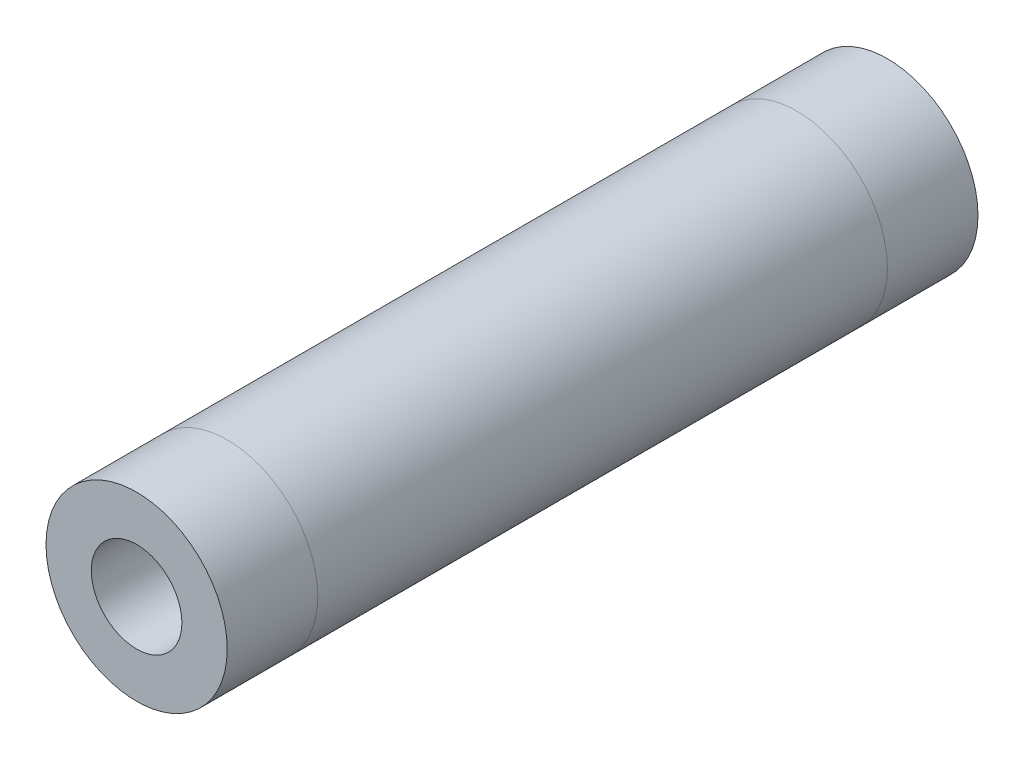
ISO-10303-21;
HEADER;
FILE_DESCRIPTION(('STEP AP214'),'2;1');
FILE_NAME('part.step','',(''),(''),'','','');
FILE_SCHEMA(('AUTOMOTIVE_DESIGN { 1 0 10303 214 1 1 1 1 }'));
ENDSEC;
DATA;
#1=APPLICATION_CONTEXT('core data for automotive mechanical design processes');
#2=APPLICATION_PROTOCOL_DEFINITION('international standard','automotive_design',2000,#1);
#3=PRODUCT_CONTEXT('',#1,'mechanical');
#4=PRODUCT('Part','Part','',(#3));
#5=PRODUCT_RELATED_PRODUCT_CATEGORY('part','',(#4));
#6=PRODUCT_DEFINITION_FORMATION('','',#4);
#7=PRODUCT_DEFINITION_CONTEXT('part definition',#1,'design');
#8=PRODUCT_DEFINITION('design','',#6,#7);
#9=PRODUCT_DEFINITION_SHAPE('','',#8);
#10=(LENGTH_UNIT() NAMED_UNIT(*) SI_UNIT(.MILLI.,.METRE.));
#11=(NAMED_UNIT(*) PLANE_ANGLE_UNIT() SI_UNIT($,.RADIAN.));
#12=(NAMED_UNIT(*) SI_UNIT($,.STERADIAN.) SOLID_ANGLE_UNIT());
#13=UNCERTAINTY_MEASURE_WITH_UNIT(LENGTH_MEASURE(1.E-05),#10,'distance_accuracy_value','');
#14=(GEOMETRIC_REPRESENTATION_CONTEXT(3) GLOBAL_UNCERTAINTY_ASSIGNED_CONTEXT((#13)) GLOBAL_UNIT_ASSIGNED_CONTEXT((#10,
#11,#12)) REPRESENTATION_CONTEXT('',''));
#15=CARTESIAN_POINT('',(0.,0.,0.));
#16=DIRECTION('',(0.,0.,1.));
#17=DIRECTION('',(1.,0.,0.));
#18=AXIS2_PLACEMENT_3D('',#15,#16,#17);
#19=CARTESIAN_POINT('',(0.,0.,-86.1379222421383));
#20=DIRECTION('',(0.,0.,1.));
#21=DIRECTION('',(1.,0.,0.));
#22=AXIS2_PLACEMENT_3D('',#19,#20,#21);
#23=CYLINDRICAL_SURFACE('',#22,6.35);
#24=CARTESIAN_POINT('',(0.,0.,-68.17741));
#25=DIRECTION('',(0.,0.,1.));
#26=DIRECTION('',(1.,0.,0.));
#27=AXIS2_PLACEMENT_3D('',#24,#25,#26);
#28=CIRCLE('',#27,6.35);
#29=CARTESIAN_POINT('',(6.35,0.,-68.17741));
#30=VERTEX_POINT('',#29);
#31=EDGE_CURVE('E12',#30,#30,#28,.F.);
#32=ORIENTED_EDGE('',*,*,#31,.F.);
#33=EDGE_LOOP('',(#32));
#34=FACE_BOUND('',#33,.T.);
#35=CARTESIAN_POINT('',(0.,0.,-28.2575));
#36=DIRECTION('',(0.,0.,1.));
#37=DIRECTION('',(1.,0.,0.));
#38=AXIS2_PLACEMENT_3D('',#35,#36,#37);
#39=CIRCLE('',#38,6.35);
#40=CARTESIAN_POINT('',(6.35,0.,-28.2575));
#41=VERTEX_POINT('',#40);
#42=EDGE_CURVE('E79',#41,#41,#39,.T.);
#43=ORIENTED_EDGE('',*,*,#42,.F.);
#44=EDGE_LOOP('',(#43));
#45=FACE_BOUND('',#44,.T.);
#46=ADVANCED_FACE('F68',(#34,#45),#23,.T.);
#47=CARTESIAN_POINT('',(0.,0.,-28.2575));
#48=DIRECTION('',(0.,0.,1.));
#49=DIRECTION('',(1.,0.,0.));
#50=AXIS2_PLACEMENT_3D('',#47,#48,#49);
#51=PLANE('',#50);
#52=CARTESIAN_POINT('',(0.,0.,-28.2575));
#53=DIRECTION('',(0.,0.,1.));
#54=DIRECTION('',(1.,0.,0.));
#55=AXIS2_PLACEMENT_3D('',#52,#53,#54);
#56=CIRCLE('',#55,4.7625);
#57=CARTESIAN_POINT('',(4.7625,0.,-28.2575));
#58=VERTEX_POINT('',#57);
#59=EDGE_CURVE('E81',#58,#58,#56,.T.);
#60=ORIENTED_EDGE('',*,*,#59,.F.);
#61=EDGE_LOOP('',(#60));
#62=FACE_BOUND('',#61,.T.);
#63=ORIENTED_EDGE('',*,*,#42,.T.);
#64=EDGE_LOOP('',(#63));
#65=FACE_BOUND('',#64,.T.);
#66=ADVANCED_FACE('F86',(#62,#65),#51,.T.);
#67=CARTESIAN_POINT('',(0.,0.,-86.1379222421383));
#68=DIRECTION('',(0.,0.,1.));
#69=DIRECTION('',(1.,0.,0.));
#70=AXIS2_PLACEMENT_3D('',#67,#68,#69);
#71=CYLINDRICAL_SURFACE('',#70,4.7625);
#72=CARTESIAN_POINT('',(0.,0.,-68.17741));
#73=DIRECTION('',(0.,0.,1.));
#74=DIRECTION('',(1.,0.,0.));
#75=AXIS2_PLACEMENT_3D('',#72,#73,#74);
#76=CIRCLE('',#75,4.7625);
#77=CARTESIAN_POINT('',(4.7625,0.,-68.17741));
#78=VERTEX_POINT('',#77);
#79=EDGE_CURVE('E71',#78,#78,#76,.F.);
#80=ORIENTED_EDGE('',*,*,#79,.T.);
#81=EDGE_LOOP('',(#80));
#82=FACE_BOUND('',#81,.T.);
#83=ORIENTED_EDGE('',*,*,#59,.T.);
#84=EDGE_LOOP('',(#83));
#85=FACE_BOUND('',#84,.T.);
#86=ADVANCED_FACE('F93',(#82,#85),#71,.F.);
#87=CARTESIAN_POINT('',(0.,0.,-68.17741));
#88=DIRECTION('',(0.,0.,1.));
#89=DIRECTION('',(1.,0.,0.));
#90=AXIS2_PLACEMENT_3D('',#87,#88,#89);
#91=PLANE('',#90);
#92=ORIENTED_EDGE('',*,*,#31,.T.);
#93=EDGE_LOOP('',(#92));
#94=FACE_BOUND('',#93,.T.);
#95=ORIENTED_EDGE('',*,*,#79,.F.);
#96=EDGE_LOOP('',(#95));
#97=FACE_BOUND('',#96,.T.);
#98=ADVANCED_FACE('F98',(#94,#97),#91,.F.);
#99=CLOSED_SHELL('',(#46,#66,#86,#98));
#100=MANIFOLD_SOLID_BREP('B2',#99);
#101=CARTESIAN_POINT('',(0.,0.,-68.17741));
#102=DIRECTION('',(0.,0.,1.));
#103=DIRECTION('',(1.,0.,0.));
#104=AXIS2_PLACEMENT_3D('',#101,#102,#103);
#105=PLANE('',#104);
#106=CARTESIAN_POINT('',(0.,0.,-68.17741));
#107=DIRECTION('',(0.,0.,1.));
#108=DIRECTION('',(1.,0.,0.));
#109=AXIS2_PLACEMENT_3D('',#106,#107,#108);
#110=CIRCLE('',#109,6.35);
#111=CARTESIAN_POINT('',(6.35,0.,-68.17741));
#112=VERTEX_POINT('',#111);
#113=EDGE_CURVE('E67',#112,#112,#110,.T.);
#114=ORIENTED_EDGE('',*,*,#113,.T.);
#115=EDGE_LOOP('',(#114));
#116=FACE_BOUND('',#115,.T.);
#117=CARTESIAN_POINT('',(0.,0.,-68.17741));
#118=DIRECTION('',(0.,0.,1.));
#119=DIRECTION('',(1.,0.,0.));
#120=AXIS2_PLACEMENT_3D('',#117,#118,#119);
#121=CIRCLE('',#120,4.7625);
#122=CARTESIAN_POINT('',(4.7625,0.,-68.17741));
#123=VERTEX_POINT('',#122);
#124=EDGE_CURVE('E151',#123,#123,#121,.T.);
#125=ORIENTED_EDGE('',*,*,#124,.F.);
#126=EDGE_LOOP('',(#125));
#127=FACE_BOUND('',#126,.T.);
#128=ADVANCED_FACE('F137',(#116,#127),#105,.T.);
#129=CARTESIAN_POINT('',(0.,0.,-68.17741));
#130=DIRECTION('',(0.,0.,-1.));
#131=DIRECTION('',(-1.,0.,0.));
#132=AXIS2_PLACEMENT_3D('',#129,#130,#131);
#133=CYLINDRICAL_SURFACE('',#132,6.35);
#134=ORIENTED_EDGE('',*,*,#113,.F.);
#135=EDGE_LOOP('',(#134));
#136=FACE_BOUND('',#135,.T.);
#137=CARTESIAN_POINT('',(0.,0.,-74.52741));
#138=DIRECTION('',(0.,0.,1.));
#139=DIRECTION('',(1.,0.,0.));
#140=AXIS2_PLACEMENT_3D('',#137,#138,#139);
#141=CIRCLE('',#140,6.35);
#142=CARTESIAN_POINT('',(6.35,0.,-74.52741));
#143=VERTEX_POINT('',#142);
#144=EDGE_CURVE('E149',#143,#143,#141,.T.);
#145=ORIENTED_EDGE('',*,*,#144,.T.);
#146=EDGE_LOOP('',(#145));
#147=FACE_BOUND('',#146,.T.);
#148=ADVANCED_FACE('F139',(#136,#147),#133,.T.);
#149=CARTESIAN_POINT('',(0.,0.,-68.17741));
#150=DIRECTION('',(0.,0.,-1.));
#151=DIRECTION('',(-1.,0.,0.));
#152=AXIS2_PLACEMENT_3D('',#149,#150,#151);
#153=CYLINDRICAL_SURFACE('',#152,3.175);
#154=CARTESIAN_POINT('',(0.,0.,-74.52741));
#155=DIRECTION('',(0.,0.,1.));
#156=DIRECTION('',(1.,0.,0.));
#157=AXIS2_PLACEMENT_3D('',#154,#155,#156);
#158=CIRCLE('',#157,3.175);
#159=CARTESIAN_POINT('',(3.175,0.,-74.52741));
#160=VERTEX_POINT('',#159);
#161=EDGE_CURVE('E141',#160,#160,#158,.T.);
#162=ORIENTED_EDGE('',*,*,#161,.F.);
#163=EDGE_LOOP('',(#162));
#164=FACE_BOUND('',#163,.T.);
#165=CARTESIAN_POINT('',(0.,0.,-61.82741));
#166=DIRECTION('',(0.,0.,1.));
#167=DIRECTION('',(1.,0.,0.));
#168=AXIS2_PLACEMENT_3D('',#165,#166,#167);
#169=CIRCLE('',#168,3.175);
#170=CARTESIAN_POINT('',(3.175,0.,-61.82741));
#171=VERTEX_POINT('',#170);
#172=EDGE_CURVE('E161',#171,#171,#169,.T.);
#173=ORIENTED_EDGE('',*,*,#172,.T.);
#174=EDGE_LOOP('',(#173));
#175=FACE_BOUND('',#174,.T.);
#176=ADVANCED_FACE('F166',(#164,#175),#153,.F.);
#177=CARTESIAN_POINT('',(0.,0.,-74.52741));
#178=DIRECTION('',(0.,0.,1.));
#179=DIRECTION('',(1.,0.,0.));
#180=AXIS2_PLACEMENT_3D('',#177,#178,#179);
#181=PLANE('',#180);
#182=ORIENTED_EDGE('',*,*,#144,.F.);
#183=EDGE_LOOP('',(#182));
#184=FACE_BOUND('',#183,.T.);
#185=ORIENTED_EDGE('',*,*,#161,.T.);
#186=EDGE_LOOP('',(#185));
#187=FACE_BOUND('',#186,.T.);
#188=ADVANCED_FACE('F171',(#184,#187),#181,.F.);
#189=CARTESIAN_POINT('',(0.,0.,-61.82741));
#190=DIRECTION('',(0.,0.,1.));
#191=DIRECTION('',(1.,0.,0.));
#192=AXIS2_PLACEMENT_3D('',#189,#190,#191);
#193=PLANE('',#192);
#194=CARTESIAN_POINT('',(0.,0.,-61.82741));
#195=DIRECTION('',(0.,0.,1.));
#196=DIRECTION('',(1.,0.,0.));
#197=AXIS2_PLACEMENT_3D('',#194,#195,#196);
#198=CIRCLE('',#197,4.7625);
#199=CARTESIAN_POINT('',(4.7625,0.,-61.82741));
#200=VERTEX_POINT('',#199);
#201=EDGE_CURVE('E154',#200,#200,#198,.T.);
#202=ORIENTED_EDGE('',*,*,#201,.T.);
#203=EDGE_LOOP('',(#202));
#204=FACE_BOUND('',#203,.T.);
#205=ORIENTED_EDGE('',*,*,#172,.F.);
#206=EDGE_LOOP('',(#205));
#207=FACE_BOUND('',#206,.T.);
#208=ADVANCED_FACE('F168',(#204,#207),#193,.T.);
#209=CARTESIAN_POINT('',(0.,0.,-61.82741));
#210=DIRECTION('',(0.,0.,-1.));
#211=DIRECTION('',(-1.,0.,0.));
#212=AXIS2_PLACEMENT_3D('',#209,#210,#211);
#213=CYLINDRICAL_SURFACE('',#212,4.7625);
#214=ORIENTED_EDGE('',*,*,#201,.F.);
#215=EDGE_LOOP('',(#214));
#216=FACE_BOUND('',#215,.T.);
#217=ORIENTED_EDGE('',*,*,#124,.T.);
#218=EDGE_LOOP('',(#217));
#219=FACE_BOUND('',#218,.T.);
#220=ADVANCED_FACE('F170',(#216,#219),#213,.T.);
#221=CLOSED_SHELL('',(#128,#148,#176,#188,#208,#220));
#222=MANIFOLD_SOLID_BREP('B7',#221);
#223=CARTESIAN_POINT('',(0.,0.,-28.2575));
#224=DIRECTION('',(0.,0.,1.));
#225=DIRECTION('',(1.,0.,0.));
#226=AXIS2_PLACEMENT_3D('',#223,#224,#225);
#227=CYLINDRICAL_SURFACE('',#226,6.35);
#228=CARTESIAN_POINT('',(0.,0.,-28.2575));
#229=DIRECTION('',(0.,0.,1.));
#230=DIRECTION('',(1.,0.,0.));
#231=AXIS2_PLACEMENT_3D('',#228,#229,#230);
#232=CIRCLE('',#231,6.35);
#233=CARTESIAN_POINT('',(6.35,0.,-28.2575));
#234=VERTEX_POINT('',#233);
#235=EDGE_CURVE('E136',#234,#234,#232,.T.);
#236=ORIENTED_EDGE('',*,*,#235,.T.);
#237=EDGE_LOOP('',(#236));
#238=FACE_BOUND('',#237,.T.);
#239=CARTESIAN_POINT('',(0.,0.,-21.9075));
#240=DIRECTION('',(0.,0.,1.));
#241=DIRECTION('',(1.,0.,0.));
#242=AXIS2_PLACEMENT_3D('',#239,#240,#241);
#243=CIRCLE('',#242,6.35);
#244=CARTESIAN_POINT('',(6.35,0.,-21.9075));
#245=VERTEX_POINT('',#244);
#246=EDGE_CURVE('E249',#245,#245,#243,.T.);
#247=ORIENTED_EDGE('',*,*,#246,.F.);
#248=EDGE_LOOP('',(#247));
#249=FACE_BOUND('',#248,.T.);
#250=ADVANCED_FACE('F238',(#238,#249),#227,.T.);
#251=CARTESIAN_POINT('',(0.,0.,-28.2575));
#252=DIRECTION('',(0.,0.,1.));
#253=DIRECTION('',(1.,0.,0.));
#254=AXIS2_PLACEMENT_3D('',#251,#252,#253);
#255=CYLINDRICAL_SURFACE('',#254,3.175);
#256=CARTESIAN_POINT('',(0.,0.,-21.9075));
#257=DIRECTION('',(0.,0.,1.));
#258=DIRECTION('',(1.,0.,0.));
#259=AXIS2_PLACEMENT_3D('',#256,#257,#258);
#260=CIRCLE('',#259,3.175);
#261=CARTESIAN_POINT('',(3.175,0.,-21.9075));
#262=VERTEX_POINT('',#261);
#263=EDGE_CURVE('E241',#262,#262,#260,.T.);
#264=ORIENTED_EDGE('',*,*,#263,.T.);
#265=EDGE_LOOP('',(#264));
#266=FACE_BOUND('',#265,.T.);
#267=CARTESIAN_POINT('',(0.,0.,-34.6075));
#268=DIRECTION('',(0.,0.,1.));
#269=DIRECTION('',(1.,0.,0.));
#270=AXIS2_PLACEMENT_3D('',#267,#268,#269);
#271=CIRCLE('',#270,3.175);
#272=CARTESIAN_POINT('',(3.175,0.,-34.6075));
#273=VERTEX_POINT('',#272);
#274=EDGE_CURVE('E261',#273,#273,#271,.T.);
#275=ORIENTED_EDGE('',*,*,#274,.F.);
#276=EDGE_LOOP('',(#275));
#277=FACE_BOUND('',#276,.T.);
#278=ADVANCED_FACE('F269',(#266,#277),#255,.F.);
#279=CARTESIAN_POINT('',(0.,0.,-28.2575));
#280=DIRECTION('',(0.,0.,1.));
#281=DIRECTION('',(1.,0.,0.));
#282=AXIS2_PLACEMENT_3D('',#279,#280,#281);
#283=PLANE('',#282);
#284=CARTESIAN_POINT('',(0.,0.,-28.2575));
#285=DIRECTION('',(0.,0.,1.));
#286=DIRECTION('',(1.,0.,0.));
#287=AXIS2_PLACEMENT_3D('',#284,#285,#286);
#288=CIRCLE('',#287,4.7625);
#289=CARTESIAN_POINT('',(4.7625,0.,-28.2575));
#290=VERTEX_POINT('',#289);
#291=EDGE_CURVE('E251',#290,#290,#288,.T.);
#292=ORIENTED_EDGE('',*,*,#291,.T.);
#293=EDGE_LOOP('',(#292));
#294=FACE_BOUND('',#293,.T.);
#295=ORIENTED_EDGE('',*,*,#235,.F.);
#296=EDGE_LOOP('',(#295));
#297=FACE_BOUND('',#296,.T.);
#298=ADVANCED_FACE('F271',(#294,#297),#283,.F.);
#299=CARTESIAN_POINT('',(0.,0.,-21.9075));
#300=DIRECTION('',(0.,0.,1.));
#301=DIRECTION('',(1.,0.,0.));
#302=AXIS2_PLACEMENT_3D('',#299,#300,#301);
#303=PLANE('',#302);
#304=ORIENTED_EDGE('',*,*,#246,.T.);
#305=EDGE_LOOP('',(#304));
#306=FACE_BOUND('',#305,.T.);
#307=ORIENTED_EDGE('',*,*,#263,.F.);
#308=EDGE_LOOP('',(#307));
#309=FACE_BOUND('',#308,.T.);
#310=ADVANCED_FACE('F277',(#306,#309),#303,.T.);
#311=CARTESIAN_POINT('',(0.,0.,-34.6075));
#312=DIRECTION('',(0.,0.,1.));
#313=DIRECTION('',(1.,0.,0.));
#314=AXIS2_PLACEMENT_3D('',#311,#312,#313);
#315=CYLINDRICAL_SURFACE('',#314,4.7625);
#316=CARTESIAN_POINT('',(0.,0.,-34.6075));
#317=DIRECTION('',(0.,0.,1.));
#318=DIRECTION('',(1.,0.,0.));
#319=AXIS2_PLACEMENT_3D('',#316,#317,#318);
#320=CIRCLE('',#319,4.7625);
#321=CARTESIAN_POINT('',(4.7625,0.,-34.6075));
#322=VERTEX_POINT('',#321);
#323=EDGE_CURVE('E254',#322,#322,#320,.T.);
#324=ORIENTED_EDGE('',*,*,#323,.T.);
#325=EDGE_LOOP('',(#324));
#326=FACE_BOUND('',#325,.T.);
#327=ORIENTED_EDGE('',*,*,#291,.F.);
#328=EDGE_LOOP('',(#327));
#329=FACE_BOUND('',#328,.T.);
#330=ADVANCED_FACE('F282',(#326,#329),#315,.T.);
#331=CARTESIAN_POINT('',(0.,0.,-34.6075));
#332=DIRECTION('',(0.,0.,1.));
#333=DIRECTION('',(1.,0.,0.));
#334=AXIS2_PLACEMENT_3D('',#331,#332,#333);
#335=PLANE('',#334);
#336=ORIENTED_EDGE('',*,*,#274,.T.);
#337=EDGE_LOOP('',(#336));
#338=FACE_BOUND('',#337,.T.);
#339=ORIENTED_EDGE('',*,*,#323,.F.);
#340=EDGE_LOOP('',(#339));
#341=FACE_BOUND('',#340,.T.);
#342=ADVANCED_FACE('F266',(#338,#341),#335,.F.);
#343=CLOSED_SHELL('',(#250,#278,#298,#310,#330,#342));
#344=MANIFOLD_SOLID_BREP('B62',#343);
#345=ADVANCED_BREP_SHAPE_REPRESENTATION('',(#18,#100,#222,#344),#14);
#346=SHAPE_DEFINITION_REPRESENTATION(#9,#345);
ENDSEC;
END-ISO-10303-21;
